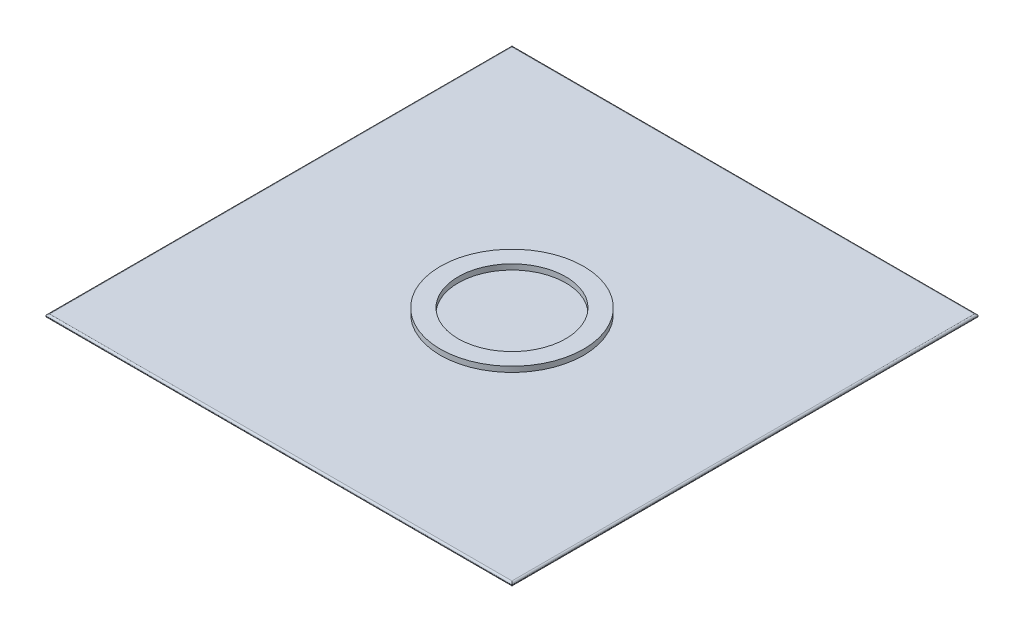
ISO-10303-21;
HEADER;
FILE_DESCRIPTION(('STEP AP214'),'2;1');
FILE_NAME('part.step','',(''),(''),'','','');
FILE_SCHEMA(('AUTOMOTIVE_DESIGN { 1 0 10303 214 1 1 1 1 }'));
ENDSEC;
DATA;
#1=APPLICATION_CONTEXT('core data for automotive mechanical design processes');
#2=APPLICATION_PROTOCOL_DEFINITION('international standard','automotive_design',2000,#1);
#3=PRODUCT_CONTEXT('',#1,'mechanical');
#4=PRODUCT('Part','Part','',(#3));
#5=PRODUCT_RELATED_PRODUCT_CATEGORY('part','',(#4));
#6=PRODUCT_DEFINITION_FORMATION('','',#4);
#7=PRODUCT_DEFINITION_CONTEXT('part definition',#1,'design');
#8=PRODUCT_DEFINITION('design','',#6,#7);
#9=PRODUCT_DEFINITION_SHAPE('','',#8);
#10=(LENGTH_UNIT() NAMED_UNIT(*) SI_UNIT(.MILLI.,.METRE.));
#11=(NAMED_UNIT(*) PLANE_ANGLE_UNIT() SI_UNIT($,.RADIAN.));
#12=(NAMED_UNIT(*) SI_UNIT($,.STERADIAN.) SOLID_ANGLE_UNIT());
#13=UNCERTAINTY_MEASURE_WITH_UNIT(LENGTH_MEASURE(1.E-05),#10,'distance_accuracy_value','');
#14=(GEOMETRIC_REPRESENTATION_CONTEXT(3) GLOBAL_UNCERTAINTY_ASSIGNED_CONTEXT((#13)) GLOBAL_UNIT_ASSIGNED_CONTEXT((#10,
#11,#12)) REPRESENTATION_CONTEXT('',''));
#15=CARTESIAN_POINT('',(0.,0.,0.));
#16=DIRECTION('',(0.,0.,1.));
#17=DIRECTION('',(1.,0.,0.));
#18=AXIS2_PLACEMENT_3D('',#15,#16,#17);
#19=CARTESIAN_POINT('',(1300.,325.555450852891,-1300.));
#20=DIRECTION('',(0.,1.,0.));
#21=DIRECTION('',(0.,0.,1.));
#22=AXIS2_PLACEMENT_3D('',#19,#20,#21);
#23=CYLINDRICAL_SURFACE('',#22,300.);
#24=CARTESIAN_POINT('',(1300.,20.,-1300.));
#25=DIRECTION('',(0.,1.,0.));
#26=DIRECTION('',(0.,0.,1.));
#27=AXIS2_PLACEMENT_3D('',#24,#25,#26);
#28=CIRCLE('',#27,300.);
#29=CARTESIAN_POINT('',(1300.,20.,-1000.));
#30=VERTEX_POINT('',#29);
#31=EDGE_CURVE('E11',#30,#30,#28,.T.);
#32=ORIENTED_EDGE('',*,*,#31,.F.);
#33=EDGE_LOOP('',(#32));
#34=FACE_BOUND('',#33,.T.);
#35=CARTESIAN_POINT('',(1300.,50.,-1300.));
#36=DIRECTION('',(0.,1.,0.));
#37=DIRECTION('',(0.,0.,1.));
#38=AXIS2_PLACEMENT_3D('',#35,#36,#37);
#39=CIRCLE('',#38,300.);
#40=CARTESIAN_POINT('',(1300.,50.,-1000.));
#41=VERTEX_POINT('',#40);
#42=EDGE_CURVE('E63',#41,#41,#39,.T.);
#43=ORIENTED_EDGE('',*,*,#42,.T.);
#44=EDGE_LOOP('',(#43));
#45=FACE_BOUND('',#44,.T.);
#46=ADVANCED_FACE('F49',(#34,#45),#23,.F.);
#47=CARTESIAN_POINT('',(1000.,20.,-1300.));
#48=DIRECTION('',(0.,1.,0.));
#49=DIRECTION('',(0.,0.,1.));
#50=AXIS2_PLACEMENT_3D('',#47,#48,#49);
#51=PLANE('',#50);
#52=CARTESIAN_POINT('',(1300.,20.,-1300.));
#53=DIRECTION('',(0.,1.,0.));
#54=DIRECTION('',(0.,0.,1.));
#55=AXIS2_PLACEMENT_3D('',#52,#53,#54);
#56=CIRCLE('',#55,400.);
#57=CARTESIAN_POINT('',(1300.,20.,-900.));
#58=VERTEX_POINT('',#57);
#59=EDGE_CURVE('E55',#58,#58,#56,.T.);
#60=ORIENTED_EDGE('',*,*,#59,.F.);
#61=EDGE_LOOP('',(#60));
#62=FACE_BOUND('',#61,.T.);
#63=ORIENTED_EDGE('',*,*,#31,.T.);
#64=EDGE_LOOP('',(#63));
#65=FACE_BOUND('',#64,.T.);
#66=ADVANCED_FACE('F78',(#62,#65),#51,.F.);
#67=CARTESIAN_POINT('',(1300.,325.555450852891,-1300.));
#68=DIRECTION('',(0.,1.,0.));
#69=DIRECTION('',(0.,0.,1.));
#70=AXIS2_PLACEMENT_3D('',#67,#68,#69);
#71=CYLINDRICAL_SURFACE('',#70,400.);
#72=CARTESIAN_POINT('',(1300.,50.,-1300.));
#73=DIRECTION('',(0.,1.,0.));
#74=DIRECTION('',(0.,0.,1.));
#75=AXIS2_PLACEMENT_3D('',#72,#73,#74);
#76=CIRCLE('',#75,400.);
#77=CARTESIAN_POINT('',(1300.,50.,-900.));
#78=VERTEX_POINT('',#77);
#79=EDGE_CURVE('E59',#78,#78,#76,.T.);
#80=ORIENTED_EDGE('',*,*,#79,.F.);
#81=EDGE_LOOP('',(#80));
#82=FACE_BOUND('',#81,.T.);
#83=ORIENTED_EDGE('',*,*,#59,.T.);
#84=EDGE_LOOP('',(#83));
#85=FACE_BOUND('',#84,.T.);
#86=ADVANCED_FACE('F73',(#82,#85),#71,.T.);
#87=CARTESIAN_POINT('',(900.,50.,-1300.));
#88=DIRECTION('',(0.,-1.,0.));
#89=DIRECTION('',(0.,0.,-1.));
#90=AXIS2_PLACEMENT_3D('',#87,#88,#89);
#91=PLANE('',#90);
#92=ORIENTED_EDGE('',*,*,#42,.F.);
#93=EDGE_LOOP('',(#92));
#94=FACE_BOUND('',#93,.T.);
#95=ORIENTED_EDGE('',*,*,#79,.T.);
#96=EDGE_LOOP('',(#95));
#97=FACE_BOUND('',#96,.T.);
#98=ADVANCED_FACE('F70',(#94,#97),#91,.F.);
#99=CLOSED_SHELL('',(#46,#66,#86,#98));
#100=MANIFOLD_SOLID_BREP('B2',#99);
#101=CARTESIAN_POINT('',(0.,20.,0.));
#102=DIRECTION('',(0.,-1.,0.));
#103=DIRECTION('',(0.,0.,-1.));
#104=AXIS2_PLACEMENT_3D('',#101,#102,#103);
#105=PLANE('',#104);
#106=DIRECTION('',(0.,0.,-1.));
#107=VECTOR('',#106,1.);
#108=CARTESIAN_POINT('',(2590.,20.,0.));
#109=LINE('',#108,#107);
#110=CARTESIAN_POINT('',(2590.,20.,-10.));
#111=VERTEX_POINT('',#110);
#112=CARTESIAN_POINT('',(2590.,20.,-2590.));
#113=VERTEX_POINT('',#112);
#114=EDGE_CURVE('E186',#111,#113,#109,.T.);
#115=ORIENTED_EDGE('',*,*,#114,.T.);
#116=DIRECTION('',(-1.,0.,0.));
#117=VECTOR('',#116,1.);
#118=CARTESIAN_POINT('',(0.,20.,-2590.));
#119=LINE('',#118,#117);
#120=CARTESIAN_POINT('',(10.0000000000007,20.,-2590.));
#121=VERTEX_POINT('',#120);
#122=EDGE_CURVE('E168',#113,#121,#119,.T.);
#123=ORIENTED_EDGE('',*,*,#122,.T.);
#124=DIRECTION('',(0.,0.,1.));
#125=VECTOR('',#124,1.);
#126=CARTESIAN_POINT('',(10.,20.,0.));
#127=LINE('',#126,#125);
#128=CARTESIAN_POINT('',(10.,20.,-10.));
#129=VERTEX_POINT('',#128);
#130=EDGE_CURVE('E177',#121,#129,#127,.T.);
#131=ORIENTED_EDGE('',*,*,#130,.T.);
#132=DIRECTION('',(1.,0.,0.));
#133=VECTOR('',#132,1.);
#134=CARTESIAN_POINT('',(0.,20.,-10.));
#135=LINE('',#134,#133);
#136=EDGE_CURVE('E182',#129,#111,#135,.T.);
#137=ORIENTED_EDGE('',*,*,#136,.T.);
#138=EDGE_LOOP('',(#115,#123,#131,#137));
#139=FACE_BOUND('',#138,.T.);
#140=ADVANCED_FACE('F111',(#139),#105,.F.);
#141=CARTESIAN_POINT('',(0.,0.,0.));
#142=DIRECTION('',(0.,-1.,0.));
#143=DIRECTION('',(0.,0.,-1.));
#144=AXIS2_PLACEMENT_3D('',#141,#142,#143);
#145=PLANE('',#144);
#146=DIRECTION('',(0.,0.,-1.));
#147=VECTOR('',#146,1.);
#148=CARTESIAN_POINT('',(2590.,0.,0.));
#149=LINE('',#148,#147);
#150=CARTESIAN_POINT('',(2590.,0.,-2590.));
#151=VERTEX_POINT('',#150);
#152=CARTESIAN_POINT('',(2590.,0.,-10.));
#153=VERTEX_POINT('',#152);
#154=EDGE_CURVE('E120',#151,#153,#149,.F.);
#155=ORIENTED_EDGE('',*,*,#154,.T.);
#156=DIRECTION('',(1.,0.,0.));
#157=VECTOR('',#156,1.);
#158=CARTESIAN_POINT('',(0.,0.,-10.));
#159=LINE('',#158,#157);
#160=CARTESIAN_POINT('',(10.,0.,-10.));
#161=VERTEX_POINT('',#160);
#162=EDGE_CURVE('E47',#153,#161,#159,.F.);
#163=ORIENTED_EDGE('',*,*,#162,.T.);
#164=DIRECTION('',(0.,0.,1.));
#165=VECTOR('',#164,1.);
#166=CARTESIAN_POINT('',(10.0000000000007,0.,-2600.));
#167=LINE('',#166,#165);
#168=CARTESIAN_POINT('',(10.0000000000007,0.,-2590.));
#169=VERTEX_POINT('',#168);
#170=EDGE_CURVE('E201',#161,#169,#167,.F.);
#171=ORIENTED_EDGE('',*,*,#170,.T.);
#172=DIRECTION('',(-1.,0.,0.));
#173=VECTOR('',#172,1.);
#174=CARTESIAN_POINT('',(2600.,0.,-2590.));
#175=LINE('',#174,#173);
#176=EDGE_CURVE('E131',#169,#151,#175,.F.);
#177=ORIENTED_EDGE('',*,*,#176,.T.);
#178=EDGE_LOOP('',(#155,#163,#171,#177));
#179=FACE_BOUND('',#178,.T.);
#180=ADVANCED_FACE('F228',(#179),#145,.T.);
#181=CARTESIAN_POINT('',(0.,10.,-10.));
#182=DIRECTION('',(1.,0.,0.));
#183=DIRECTION('',(0.,0.,-1.));
#184=AXIS2_PLACEMENT_3D('',#181,#182,#183);
#185=CYLINDRICAL_SURFACE('',#184,10.);
#186=CARTESIAN_POINT('',(10.,10.,-10.));
#187=DIRECTION('',(0.707106781186547,0.,0.707106781186548));
#188=DIRECTION('',(-0.707106781186548,0.,0.707106781186547));
#189=AXIS2_PLACEMENT_3D('',#186,#187,#188);
#190=ELLIPSE('',#189,14.142135623731,10.);
#191=CARTESIAN_POINT('',(0.,10.,0.));
#192=VERTEX_POINT('',#191);
#193=EDGE_CURVE('E179',#192,#129,#190,.F.);
#194=ORIENTED_EDGE('',*,*,#193,.F.);
#195=DIRECTION('',(1.,0.,0.));
#196=VECTOR('',#195,1.);
#197=CARTESIAN_POINT('',(0.,10.,0.));
#198=LINE('',#197,#196);
#199=CARTESIAN_POINT('',(2600.,10.,0.));
#200=VERTEX_POINT('',#199);
#201=EDGE_CURVE('E196',#200,#192,#198,.F.);
#202=ORIENTED_EDGE('',*,*,#201,.F.);
#203=CARTESIAN_POINT('',(2590.,10.,-10.));
#204=DIRECTION('',(0.707106781186547,0.,-0.707106781186547));
#205=DIRECTION('',(0.707106781186547,0.,0.707106781186547));
#206=AXIS2_PLACEMENT_3D('',#203,#204,#205);
#207=ELLIPSE('',#206,14.1421356237309,10.);
#208=EDGE_CURVE('E183',#111,#200,#207,.T.);
#209=ORIENTED_EDGE('',*,*,#208,.F.);
#210=ORIENTED_EDGE('',*,*,#136,.F.);
#211=EDGE_LOOP('',(#194,#202,#209,#210));
#212=FACE_BOUND('',#211,.T.);
#213=ADVANCED_FACE('F230',(#212),#185,.T.);
#214=CARTESIAN_POINT('',(2590.,10.,0.));
#215=DIRECTION('',(0.,0.,-1.));
#216=DIRECTION('',(-1.,0.,0.));
#217=AXIS2_PLACEMENT_3D('',#214,#215,#216);
#218=CYLINDRICAL_SURFACE('',#217,10.);
#219=ORIENTED_EDGE('',*,*,#208,.T.);
#220=DIRECTION('',(0.,0.,-1.));
#221=VECTOR('',#220,1.);
#222=CARTESIAN_POINT('',(2600.,10.,0.));
#223=LINE('',#222,#221);
#224=CARTESIAN_POINT('',(2600.,10.,-2600.));
#225=VERTEX_POINT('',#224);
#226=EDGE_CURVE('E189',#225,#200,#223,.F.);
#227=ORIENTED_EDGE('',*,*,#226,.F.);
#228=CARTESIAN_POINT('',(2590.,10.,-2590.));
#229=DIRECTION('',(-0.707106781186547,0.,-0.707106781186547));
#230=DIRECTION('',(0.707106781186547,0.,-0.707106781186547));
#231=AXIS2_PLACEMENT_3D('',#228,#229,#230);
#232=ELLIPSE('',#231,14.1421356237309,10.);
#233=EDGE_CURVE('E174',#113,#225,#232,.T.);
#234=ORIENTED_EDGE('',*,*,#233,.F.);
#235=ORIENTED_EDGE('',*,*,#114,.F.);
#236=EDGE_LOOP('',(#219,#227,#234,#235));
#237=FACE_BOUND('',#236,.T.);
#238=ADVANCED_FACE('F236',(#237),#218,.T.);
#239=CARTESIAN_POINT('',(10.,10.,0.));
#240=DIRECTION('',(0.,0.,1.));
#241=DIRECTION('',(1.,0.,0.));
#242=AXIS2_PLACEMENT_3D('',#239,#240,#241);
#243=CYLINDRICAL_SURFACE('',#242,10.);
#244=ORIENTED_EDGE('',*,*,#193,.T.);
#245=ORIENTED_EDGE('',*,*,#130,.F.);
#246=CARTESIAN_POINT('',(10.0000000000007,10.,-2590.));
#247=DIRECTION('',(-0.707106781186548,0.,0.707106781186547));
#248=DIRECTION('',(0.707106781186547,0.,0.707106781186548));
#249=AXIS2_PLACEMENT_3D('',#246,#247,#248);
#250=ELLIPSE('',#249,14.1421356237309,10.);
#251=CARTESIAN_POINT('',(6.85562717706034E-13,10.,-2600.));
#252=VERTEX_POINT('',#251);
#253=EDGE_CURVE('E164',#252,#121,#250,.F.);
#254=ORIENTED_EDGE('',*,*,#253,.F.);
#255=DIRECTION('',(0.,0.,1.));
#256=VECTOR('',#255,1.);
#257=CARTESIAN_POINT('',(0.,10.,0.));
#258=LINE('',#257,#256);
#259=EDGE_CURVE('E199',#192,#252,#258,.F.);
#260=ORIENTED_EDGE('',*,*,#259,.F.);
#261=EDGE_LOOP('',(#244,#245,#254,#260));
#262=FACE_BOUND('',#261,.T.);
#263=ADVANCED_FACE('F178',(#262),#243,.T.);
#264=CARTESIAN_POINT('',(0.,10.,-2590.));
#265=DIRECTION('',(-1.,0.,0.));
#266=DIRECTION('',(0.,0.,1.));
#267=AXIS2_PLACEMENT_3D('',#264,#265,#266);
#268=CYLINDRICAL_SURFACE('',#267,10.);
#269=ORIENTED_EDGE('',*,*,#233,.T.);
#270=DIRECTION('',(-1.,0.,0.));
#271=VECTOR('',#270,1.);
#272=CARTESIAN_POINT('',(6.85562717706034E-13,10.,-2600.));
#273=LINE('',#272,#271);
#274=EDGE_CURVE('E170',#252,#225,#273,.F.);
#275=ORIENTED_EDGE('',*,*,#274,.F.);
#276=ORIENTED_EDGE('',*,*,#253,.T.);
#277=ORIENTED_EDGE('',*,*,#122,.F.);
#278=EDGE_LOOP('',(#269,#275,#276,#277));
#279=FACE_BOUND('',#278,.T.);
#280=ADVANCED_FACE('F166',(#279),#268,.T.);
#281=CARTESIAN_POINT('',(6.85562717706034E-13,10.,-2590.));
#282=DIRECTION('',(1.,0.,0.));
#283=DIRECTION('',(0.,0.,-1.));
#284=AXIS2_PLACEMENT_3D('',#281,#282,#283);
#285=CYLINDRICAL_SURFACE('',#284,10.);
#286=CARTESIAN_POINT('',(2590.,10.,-2590.));
#287=DIRECTION('',(0.707106781186547,0.,0.707106781186547));
#288=DIRECTION('',(0.707106781186547,0.,-0.707106781186547));
#289=AXIS2_PLACEMENT_3D('',#286,#287,#288);
#290=ELLIPSE('',#289,14.1421356237309,10.);
#291=EDGE_CURVE('E213',#151,#225,#290,.T.);
#292=ORIENTED_EDGE('',*,*,#291,.F.);
#293=ORIENTED_EDGE('',*,*,#176,.F.);
#294=CARTESIAN_POINT('',(10.0000000000007,10.,-2590.));
#295=DIRECTION('',(0.707106781186548,0.,-0.707106781186547));
#296=DIRECTION('',(-0.707106781186547,0.,-0.707106781186548));
#297=AXIS2_PLACEMENT_3D('',#294,#295,#296);
#298=ELLIPSE('',#297,14.1421356237309,10.);
#299=EDGE_CURVE('E115',#252,#169,#298,.F.);
#300=ORIENTED_EDGE('',*,*,#299,.F.);
#301=ORIENTED_EDGE('',*,*,#274,.T.);
#302=EDGE_LOOP('',(#292,#293,#300,#301));
#303=FACE_BOUND('',#302,.T.);
#304=ADVANCED_FACE('F113',(#303),#285,.T.);
#305=CARTESIAN_POINT('',(10.,10.,0.));
#306=DIRECTION('',(0.,0.,-1.));
#307=DIRECTION('',(-1.,0.,0.));
#308=AXIS2_PLACEMENT_3D('',#305,#306,#307);
#309=CYLINDRICAL_SURFACE('',#308,10.);
#310=ORIENTED_EDGE('',*,*,#299,.T.);
#311=ORIENTED_EDGE('',*,*,#170,.F.);
#312=CARTESIAN_POINT('',(10.,10.,-10.));
#313=DIRECTION('',(-0.707106781186547,0.,-0.707106781186548));
#314=DIRECTION('',(0.707106781186548,0.,-0.707106781186547));
#315=AXIS2_PLACEMENT_3D('',#312,#313,#314);
#316=ELLIPSE('',#315,14.142135623731,10.);
#317=EDGE_CURVE('E212',#192,#161,#316,.F.);
#318=ORIENTED_EDGE('',*,*,#317,.F.);
#319=ORIENTED_EDGE('',*,*,#259,.T.);
#320=EDGE_LOOP('',(#310,#311,#318,#319));
#321=FACE_BOUND('',#320,.T.);
#322=ADVANCED_FACE('F219',(#321),#309,.T.);
#323=CARTESIAN_POINT('',(2590.,10.,0.));
#324=DIRECTION('',(0.,0.,1.));
#325=DIRECTION('',(1.,0.,0.));
#326=AXIS2_PLACEMENT_3D('',#323,#324,#325);
#327=CYLINDRICAL_SURFACE('',#326,10.);
#328=ORIENTED_EDGE('',*,*,#291,.T.);
#329=ORIENTED_EDGE('',*,*,#226,.T.);
#330=CARTESIAN_POINT('',(2590.,10.,-10.));
#331=DIRECTION('',(-0.707106781186547,0.,0.707106781186547));
#332=DIRECTION('',(0.707106781186547,0.,0.707106781186547));
#333=AXIS2_PLACEMENT_3D('',#330,#331,#332);
#334=ELLIPSE('',#333,14.1421356237309,10.);
#335=EDGE_CURVE('E210',#153,#200,#334,.T.);
#336=ORIENTED_EDGE('',*,*,#335,.F.);
#337=ORIENTED_EDGE('',*,*,#154,.F.);
#338=EDGE_LOOP('',(#328,#329,#336,#337));
#339=FACE_BOUND('',#338,.T.);
#340=ADVANCED_FACE('F223',(#339),#327,.T.);
#341=CARTESIAN_POINT('',(0.,10.,-10.));
#342=DIRECTION('',(-1.,0.,0.));
#343=DIRECTION('',(0.,0.,1.));
#344=AXIS2_PLACEMENT_3D('',#341,#342,#343);
#345=CYLINDRICAL_SURFACE('',#344,10.);
#346=ORIENTED_EDGE('',*,*,#317,.T.);
#347=ORIENTED_EDGE('',*,*,#162,.F.);
#348=ORIENTED_EDGE('',*,*,#335,.T.);
#349=ORIENTED_EDGE('',*,*,#201,.T.);
#350=EDGE_LOOP('',(#346,#347,#348,#349));
#351=FACE_BOUND('',#350,.T.);
#352=ADVANCED_FACE('F227',(#351),#345,.T.);
#353=CLOSED_SHELL('',(#140,#180,#213,#238,#263,#280,#304,#322,#340,#352));
#354=MANIFOLD_SOLID_BREP('B6',#353);
#355=ADVANCED_BREP_SHAPE_REPRESENTATION('',(#18,#100,#354),#14);
#356=SHAPE_DEFINITION_REPRESENTATION(#9,#355);
ENDSEC;
END-ISO-10303-21;
